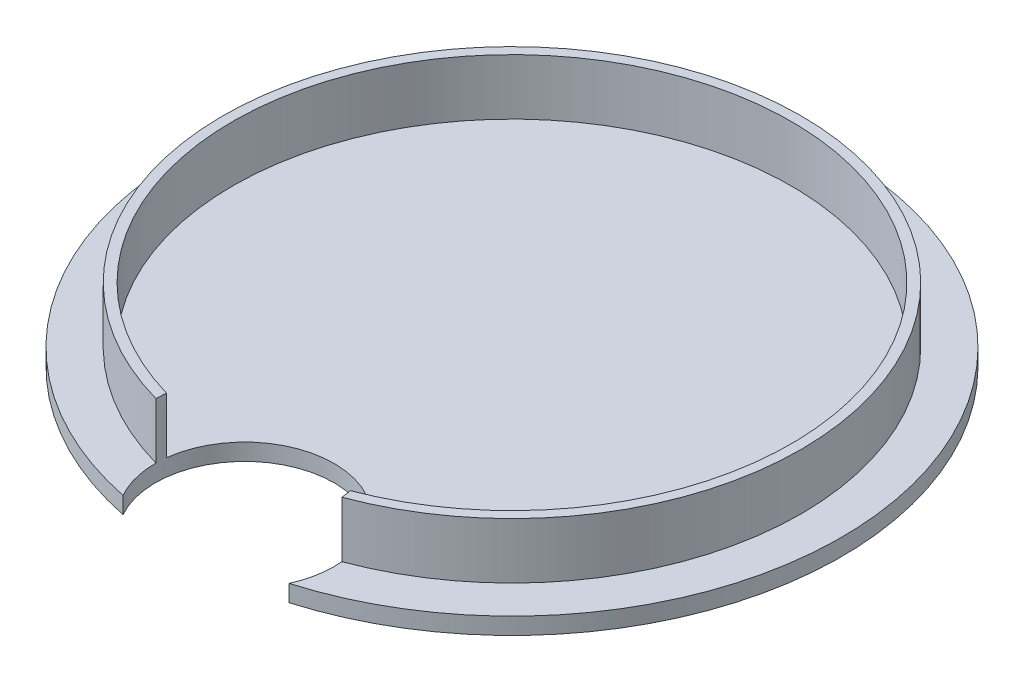
ISO-10303-21;
HEADER;
FILE_DESCRIPTION(('STEP AP214'),'2;1');
FILE_NAME('part.step','',(''),(''),'','','');
FILE_SCHEMA(('AUTOMOTIVE_DESIGN { 1 0 10303 214 1 1 1 1 }'));
ENDSEC;
DATA;
#1=APPLICATION_CONTEXT('core data for automotive mechanical design processes');
#2=APPLICATION_PROTOCOL_DEFINITION('international standard','automotive_design',2000,#1);
#3=PRODUCT_CONTEXT('',#1,'mechanical');
#4=PRODUCT('Part','Part','',(#3));
#5=PRODUCT_RELATED_PRODUCT_CATEGORY('part','',(#4));
#6=PRODUCT_DEFINITION_FORMATION('','',#4);
#7=PRODUCT_DEFINITION_CONTEXT('part definition',#1,'design');
#8=PRODUCT_DEFINITION('design','',#6,#7);
#9=PRODUCT_DEFINITION_SHAPE('','',#8);
#10=(LENGTH_UNIT() NAMED_UNIT(*) SI_UNIT(.MILLI.,.METRE.));
#11=(NAMED_UNIT(*) PLANE_ANGLE_UNIT() SI_UNIT($,.RADIAN.));
#12=(NAMED_UNIT(*) SI_UNIT($,.STERADIAN.) SOLID_ANGLE_UNIT());
#13=UNCERTAINTY_MEASURE_WITH_UNIT(LENGTH_MEASURE(1.E-05),#10,'distance_accuracy_value','');
#14=(GEOMETRIC_REPRESENTATION_CONTEXT(3) GLOBAL_UNCERTAINTY_ASSIGNED_CONTEXT((#13)) GLOBAL_UNIT_ASSIGNED_CONTEXT((#10,
#11,#12)) REPRESENTATION_CONTEXT('',''));
#15=CARTESIAN_POINT('',(0.,0.,0.));
#16=DIRECTION('',(0.,0.,1.));
#17=DIRECTION('',(1.,0.,0.));
#18=AXIS2_PLACEMENT_3D('',#15,#16,#17);
#19=CARTESIAN_POINT('',(-0.0719251622026425,2.70570789291162,-1.70254747961106));
#20=DIRECTION('',(0.,-1.,0.));
#21=DIRECTION('',(0.,0.,-1.));
#22=AXIS2_PLACEMENT_3D('',#19,#20,#21);
#23=CYLINDRICAL_SURFACE('',#22,29.5);
#24=CARTESIAN_POINT('',(-0.0719251622026425,1.20570789291162,-1.70254747961106));
#25=DIRECTION('',(0.,1.,0.));
#26=DIRECTION('',(0.,0.,1.));
#27=AXIS2_PLACEMENT_3D('',#24,#25,#26);
#28=CIRCLE('',#27,29.5);
#29=CARTESIAN_POINT('',(8.26149844557245,1.20570789291162,26.5959339456064));
#30=VERTEX_POINT('',#29);
#31=CARTESIAN_POINT('',(-5.98894272567319,1.20570789291162,27.197952570623));
#32=VERTEX_POINT('',#31);
#33=EDGE_CURVE('E106',#30,#32,#28,.T.);
#34=ORIENTED_EDGE('',*,*,#33,.T.);
#35=DIRECTION('',(0.,1.,0.));
#36=VECTOR('',#35,1.);
#37=CARTESIAN_POINT('',(-5.9889427256732,3.95570789291161,27.197952570623));
#38=LINE('',#37,#36);
#39=CARTESIAN_POINT('',(-5.98894272567318,2.70570789291162,27.197952570623));
#40=VERTEX_POINT('',#39);
#41=EDGE_CURVE('E126',#32,#40,#38,.T.);
#42=ORIENTED_EDGE('',*,*,#41,.T.);
#43=CARTESIAN_POINT('',(-0.0719251622026425,2.70570789291162,-1.70254747961106));
#44=DIRECTION('',(0.,1.,0.));
#45=DIRECTION('',(0.,0.,1.));
#46=AXIS2_PLACEMENT_3D('',#43,#44,#45);
#47=CIRCLE('',#46,29.5);
#48=CARTESIAN_POINT('',(8.26149844557244,2.70570789291162,26.5959339456064));
#49=VERTEX_POINT('',#48);
#50=EDGE_CURVE('E110',#49,#40,#47,.T.);
#51=ORIENTED_EDGE('',*,*,#50,.F.);
#52=DIRECTION('',(0.,1.,0.));
#53=VECTOR('',#52,1.);
#54=CARTESIAN_POINT('',(8.26149844557245,3.95570789291161,26.5959339456064));
#55=LINE('',#54,#53);
#56=EDGE_CURVE('E124',#49,#30,#55,.F.);
#57=ORIENTED_EDGE('',*,*,#56,.T.);
#58=EDGE_LOOP('',(#34,#42,#51,#57));
#59=FACE_BOUND('',#58,.T.);
#60=ADVANCED_FACE('F35',(#59),#23,.T.);
#61=CARTESIAN_POINT('',(-0.0719251622026425,2.70570789291162,-1.70254747961106));
#62=DIRECTION('',(0.,1.,0.));
#63=DIRECTION('',(0.,0.,1.));
#64=AXIS2_PLACEMENT_3D('',#61,#62,#63);
#65=PLANE('',#64);
#66=CARTESIAN_POINT('',(0.983273983781873,2.70570789291162,23.2751736887084));
#67=DIRECTION('',(0.,1.,0.));
#68=DIRECTION('',(0.,0.,1.));
#69=AXIS2_PLACEMENT_3D('',#66,#67,#68);
#70=CIRCLE('',#69,8.);
#71=CARTESIAN_POINT('',(8.95020864554816,2.70570789291161,22.5485705679149));
#72=VERTEX_POINT('',#71);
#73=EDGE_CURVE('E88',#49,#72,#70,.T.);
#74=ORIENTED_EDGE('',*,*,#73,.F.);
#75=ORIENTED_EDGE('',*,*,#50,.T.);
#76=CARTESIAN_POINT('',(-7.01655651136048,2.70570789291162,23.2230963520795));
#77=VERTEX_POINT('',#76);
#78=EDGE_CURVE('E120',#77,#40,#70,.T.);
#79=ORIENTED_EDGE('',*,*,#78,.F.);
#80=CARTESIAN_POINT('',(-0.0719251622026425,2.70570789291162,-1.70254747961106));
#81=DIRECTION('',(0.,1.,0.));
#82=DIRECTION('',(0.,0.,1.));
#83=AXIS2_PLACEMENT_3D('',#80,#81,#82);
#84=CIRCLE('',#83,25.875);
#85=EDGE_CURVE('E42',#72,#77,#84,.T.);
#86=ORIENTED_EDGE('',*,*,#85,.F.);
#87=EDGE_LOOP('',(#74,#75,#79,#86));
#88=FACE_BOUND('',#87,.T.);
#89=ADVANCED_FACE('F119',(#88),#65,.T.);
#90=CARTESIAN_POINT('',(-0.0719251622026425,1.20570789291162,-1.70254747961106));
#91=DIRECTION('',(0.,1.,0.));
#92=DIRECTION('',(0.,0.,1.));
#93=AXIS2_PLACEMENT_3D('',#90,#91,#92);
#94=PLANE('',#93);
#95=ORIENTED_EDGE('',*,*,#33,.F.);
#96=CARTESIAN_POINT('',(0.983273983781873,1.20570789291162,23.2751736887084));
#97=DIRECTION('',(0.,1.,0.));
#98=DIRECTION('',(0.,0.,1.));
#99=AXIS2_PLACEMENT_3D('',#96,#97,#98);
#100=CIRCLE('',#99,8.);
#101=EDGE_CURVE('E128',#30,#32,#100,.T.);
#102=ORIENTED_EDGE('',*,*,#101,.T.);
#103=EDGE_LOOP('',(#95,#102));
#104=FACE_BOUND('',#103,.T.);
#105=ADVANCED_FACE('F154',(#104),#94,.F.);
#106=CARTESIAN_POINT('',(-0.0719251622026425,7.70570789291161,-1.70254747961106));
#107=DIRECTION('',(0.,-1.,0.));
#108=DIRECTION('',(0.,0.,-1.));
#109=AXIS2_PLACEMENT_3D('',#106,#107,#108);
#110=CYLINDRICAL_SURFACE('',#109,25.875);
#111=ORIENTED_EDGE('',*,*,#85,.T.);
#112=DIRECTION('',(0.,1.,0.));
#113=VECTOR('',#112,1.);
#114=CARTESIAN_POINT('',(-7.01655651136049,3.95570789291161,23.2230963520795));
#115=LINE('',#114,#113);
#116=CARTESIAN_POINT('',(-7.01655651136049,7.70570789291161,23.2230963520795));
#117=VERTEX_POINT('',#116);
#118=EDGE_CURVE('E55',#77,#117,#115,.T.);
#119=ORIENTED_EDGE('',*,*,#118,.T.);
#120=CARTESIAN_POINT('',(-0.0719251622026425,7.70570789291161,-1.70254747961106));
#121=DIRECTION('',(0.,1.,0.));
#122=DIRECTION('',(0.,0.,1.));
#123=AXIS2_PLACEMENT_3D('',#120,#121,#122);
#124=CIRCLE('',#123,25.875);
#125=CARTESIAN_POINT('',(8.95020864554816,7.70570789291161,22.5485705679149));
#126=VERTEX_POINT('',#125);
#127=EDGE_CURVE('E99',#126,#117,#124,.T.);
#128=ORIENTED_EDGE('',*,*,#127,.F.);
#129=DIRECTION('',(0.,1.,0.));
#130=VECTOR('',#129,1.);
#131=CARTESIAN_POINT('',(8.95020864554816,3.95570789291161,22.5485705679149));
#132=LINE('',#131,#130);
#133=EDGE_CURVE('E83',#126,#72,#132,.F.);
#134=ORIENTED_EDGE('',*,*,#133,.T.);
#135=EDGE_LOOP('',(#111,#119,#128,#134));
#136=FACE_BOUND('',#135,.T.);
#137=ADVANCED_FACE('F105',(#136),#110,.T.);
#138=CARTESIAN_POINT('',(-0.0719251622026425,7.70570789291161,-1.70254747961106));
#139=DIRECTION('',(0.,1.,0.));
#140=DIRECTION('',(0.,0.,1.));
#141=AXIS2_PLACEMENT_3D('',#138,#139,#140);
#142=PLANE('',#141);
#143=CARTESIAN_POINT('',(0.983273983781873,7.70570789291161,23.2751736887084));
#144=DIRECTION('',(0.,1.,0.));
#145=DIRECTION('',(0.,0.,1.));
#146=AXIS2_PLACEMENT_3D('',#143,#144,#145);
#147=CIRCLE('',#146,8.);
#148=CARTESIAN_POINT('',(8.81914652180975,7.70570789291161,21.6630007551245));
#149=VERTEX_POINT('',#148);
#150=EDGE_CURVE('E86',#126,#149,#147,.T.);
#151=ORIENTED_EDGE('',*,*,#150,.F.);
#152=ORIENTED_EDGE('',*,*,#127,.T.);
#153=CARTESIAN_POINT('',(-6.96065094679482,7.70570789291161,22.3296279746564));
#154=VERTEX_POINT('',#153);
#155=EDGE_CURVE('E103',#154,#117,#147,.T.);
#156=ORIENTED_EDGE('',*,*,#155,.F.);
#157=CARTESIAN_POINT('',(-0.0719251622026425,7.70570789291161,-1.70254747961106));
#158=DIRECTION('',(0.,1.,0.));
#159=DIRECTION('',(0.,0.,1.));
#160=AXIS2_PLACEMENT_3D('',#157,#158,#159);
#161=CIRCLE('',#160,25.);
#162=EDGE_CURVE('E101',#149,#154,#161,.T.);
#163=ORIENTED_EDGE('',*,*,#162,.F.);
#164=EDGE_LOOP('',(#151,#152,#156,#163));
#165=FACE_BOUND('',#164,.T.);
#166=ADVANCED_FACE('F97',(#165),#142,.T.);
#167=CARTESIAN_POINT('',(-0.0719251622026425,2.70570789291161,-1.70254747961106));
#168=DIRECTION('',(0.,1.,0.));
#169=DIRECTION('',(0.,0.,1.));
#170=AXIS2_PLACEMENT_3D('',#167,#168,#169);
#171=CYLINDRICAL_SURFACE('',#170,25.);
#172=CARTESIAN_POINT('',(-0.0719251622026425,2.70570789291161,-1.70254747961106));
#173=DIRECTION('',(0.,1.,0.));
#174=DIRECTION('',(0.,0.,1.));
#175=AXIS2_PLACEMENT_3D('',#172,#173,#174);
#176=CIRCLE('',#175,25.);
#177=CARTESIAN_POINT('',(8.81914652180975,2.70570789291161,21.6630007551245));
#178=VERTEX_POINT('',#177);
#179=CARTESIAN_POINT('',(-6.96065094679482,2.70570789291161,22.3296279746564));
#180=VERTEX_POINT('',#179);
#181=EDGE_CURVE('E107',#178,#180,#176,.T.);
#182=ORIENTED_EDGE('',*,*,#181,.F.);
#183=DIRECTION('',(0.,1.,0.));
#184=VECTOR('',#183,1.);
#185=CARTESIAN_POINT('',(8.81914652180975,3.95570789291161,21.6630007551245));
#186=LINE('',#185,#184);
#187=EDGE_CURVE('E48',#178,#149,#186,.T.);
#188=ORIENTED_EDGE('',*,*,#187,.T.);
#189=ORIENTED_EDGE('',*,*,#162,.T.);
#190=DIRECTION('',(0.,1.,0.));
#191=VECTOR('',#190,1.);
#192=CARTESIAN_POINT('',(-6.96065094679482,3.95570789291161,22.3296279746564));
#193=LINE('',#192,#191);
#194=EDGE_CURVE('E102',#154,#180,#193,.F.);
#195=ORIENTED_EDGE('',*,*,#194,.T.);
#196=EDGE_LOOP('',(#182,#188,#189,#195));
#197=FACE_BOUND('',#196,.T.);
#198=ADVANCED_FACE('F137',(#197),#171,.F.);
#199=CARTESIAN_POINT('',(-0.0719251622026425,2.70570789291161,-1.70254747961106));
#200=DIRECTION('',(0.,1.,0.));
#201=DIRECTION('',(0.,0.,1.));
#202=AXIS2_PLACEMENT_3D('',#199,#200,#201);
#203=PLANE('',#202);
#204=CARTESIAN_POINT('',(0.983273983781873,2.70570789291161,23.2751736887084));
#205=DIRECTION('',(0.,1.,0.));
#206=DIRECTION('',(0.,0.,1.));
#207=AXIS2_PLACEMENT_3D('',#204,#205,#206);
#208=CIRCLE('',#207,8.);
#209=EDGE_CURVE('E11',#178,#180,#208,.T.);
#210=ORIENTED_EDGE('',*,*,#209,.F.);
#211=ORIENTED_EDGE('',*,*,#181,.T.);
#212=EDGE_LOOP('',(#210,#211));
#213=FACE_BOUND('',#212,.T.);
#214=ADVANCED_FACE('F141',(#213),#203,.T.);
#215=CARTESIAN_POINT('',(0.983273983781873,0.205707892911614,23.2751736887084));
#216=DIRECTION('',(0.,1.,0.));
#217=DIRECTION('',(0.,0.,1.));
#218=AXIS2_PLACEMENT_3D('',#215,#216,#217);
#219=CYLINDRICAL_SURFACE('',#218,8.);
#220=ORIENTED_EDGE('',*,*,#78,.T.);
#221=ORIENTED_EDGE('',*,*,#41,.F.);
#222=ORIENTED_EDGE('',*,*,#101,.F.);
#223=ORIENTED_EDGE('',*,*,#56,.F.);
#224=ORIENTED_EDGE('',*,*,#73,.T.);
#225=ORIENTED_EDGE('',*,*,#133,.F.);
#226=ORIENTED_EDGE('',*,*,#150,.T.);
#227=ORIENTED_EDGE('',*,*,#187,.F.);
#228=ORIENTED_EDGE('',*,*,#209,.T.);
#229=ORIENTED_EDGE('',*,*,#194,.F.);
#230=ORIENTED_EDGE('',*,*,#155,.T.);
#231=ORIENTED_EDGE('',*,*,#118,.F.);
#232=EDGE_LOOP('',(#220,#221,#222,#223,#224,#225,#226,#227,#228,#229,#230,#231));
#233=FACE_BOUND('',#232,.T.);
#234=ADVANCED_FACE('F85',(#233),#219,.F.);
#235=CLOSED_SHELL('',(#60,#89,#105,#137,#166,#198,#214,#234));
#236=MANIFOLD_SOLID_BREP('B2',#235);
#237=ADVANCED_BREP_SHAPE_REPRESENTATION('',(#18,#236),#14);
#238=SHAPE_DEFINITION_REPRESENTATION(#9,#237);
ENDSEC;
END-ISO-10303-21;
